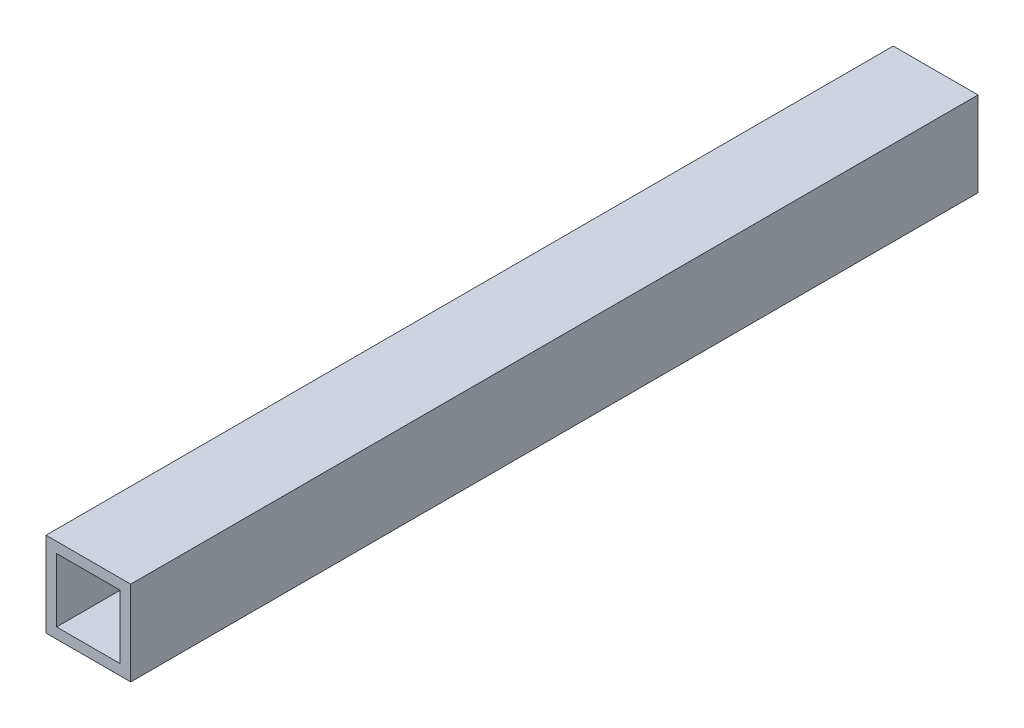
ISO-10303-21;
HEADER;
FILE_DESCRIPTION(('STEP AP214'),'2;1');
FILE_NAME('part.step','',(''),(''),'','','');
FILE_SCHEMA(('AUTOMOTIVE_DESIGN { 1 0 10303 214 1 1 1 1 }'));
ENDSEC;
DATA;
#1=APPLICATION_CONTEXT('core data for automotive mechanical design processes');
#2=APPLICATION_PROTOCOL_DEFINITION('international standard','automotive_design',2000,#1);
#3=PRODUCT_CONTEXT('',#1,'mechanical');
#4=PRODUCT('Part','Part','',(#3));
#5=PRODUCT_RELATED_PRODUCT_CATEGORY('part','',(#4));
#6=PRODUCT_DEFINITION_FORMATION('','',#4);
#7=PRODUCT_DEFINITION_CONTEXT('part definition',#1,'design');
#8=PRODUCT_DEFINITION('design','',#6,#7);
#9=PRODUCT_DEFINITION_SHAPE('','',#8);
#10=(LENGTH_UNIT() NAMED_UNIT(*) SI_UNIT(.MILLI.,.METRE.));
#11=(NAMED_UNIT(*) PLANE_ANGLE_UNIT() SI_UNIT($,.RADIAN.));
#12=(NAMED_UNIT(*) SI_UNIT($,.STERADIAN.) SOLID_ANGLE_UNIT());
#13=UNCERTAINTY_MEASURE_WITH_UNIT(LENGTH_MEASURE(1.E-05),#10,'distance_accuracy_value','');
#14=(GEOMETRIC_REPRESENTATION_CONTEXT(3) GLOBAL_UNCERTAINTY_ASSIGNED_CONTEXT((#13)) GLOBAL_UNIT_ASSIGNED_CONTEXT((#10,
#11,#12)) REPRESENTATION_CONTEXT('',''));
#15=CARTESIAN_POINT('',(0.,0.,0.));
#16=DIRECTION('',(0.,0.,1.));
#17=DIRECTION('',(1.,0.,0.));
#18=AXIS2_PLACEMENT_3D('',#15,#16,#17);
#19=CARTESIAN_POINT('',(0.,0.,400.));
#20=DIRECTION('',(0.,0.,1.));
#21=DIRECTION('',(1.,0.,0.));
#22=AXIS2_PLACEMENT_3D('',#19,#20,#21);
#23=PLANE('',#22);
#24=DIRECTION('',(0.,-1.,0.));
#25=VECTOR('',#24,1.);
#26=CARTESIAN_POINT('',(0.,0.,400.));
#27=LINE('',#26,#25);
#28=CARTESIAN_POINT('',(0.,40.,400.));
#29=VERTEX_POINT('',#28);
#30=CARTESIAN_POINT('',(0.,0.,400.));
#31=VERTEX_POINT('',#30);
#32=EDGE_CURVE('E159',#29,#31,#27,.T.);
#33=ORIENTED_EDGE('',*,*,#32,.T.);
#34=DIRECTION('',(1.,0.,0.));
#35=VECTOR('',#34,1.);
#36=CARTESIAN_POINT('',(0.,0.,400.));
#37=LINE('',#36,#35);
#38=CARTESIAN_POINT('',(40.,0.,400.));
#39=VERTEX_POINT('',#38);
#40=EDGE_CURVE('E162',#31,#39,#37,.T.);
#41=ORIENTED_EDGE('',*,*,#40,.T.);
#42=DIRECTION('',(0.,1.,0.));
#43=VECTOR('',#42,1.);
#44=CARTESIAN_POINT('',(40.,0.,400.));
#45=LINE('',#44,#43);
#46=CARTESIAN_POINT('',(40.,40.,400.));
#47=VERTEX_POINT('',#46);
#48=EDGE_CURVE('E165',#39,#47,#45,.T.);
#49=ORIENTED_EDGE('',*,*,#48,.T.);
#50=DIRECTION('',(-1.,0.,0.));
#51=VECTOR('',#50,1.);
#52=CARTESIAN_POINT('',(0.,40.,400.));
#53=LINE('',#52,#51);
#54=EDGE_CURVE('E167',#47,#29,#53,.T.);
#55=ORIENTED_EDGE('',*,*,#54,.T.);
#56=EDGE_LOOP('',(#33,#41,#49,#55));
#57=FACE_BOUND('',#56,.T.);
#58=DIRECTION('',(1.,0.,0.));
#59=VECTOR('',#58,1.);
#60=CARTESIAN_POINT('',(0.,5.,400.));
#61=LINE('',#60,#59);
#62=CARTESIAN_POINT('',(5.,5.,400.));
#63=VERTEX_POINT('',#62);
#64=CARTESIAN_POINT('',(35.,5.,400.));
#65=VERTEX_POINT('',#64);
#66=EDGE_CURVE('E131',#63,#65,#61,.T.);
#67=ORIENTED_EDGE('',*,*,#66,.F.);
#68=DIRECTION('',(0.,-1.,0.));
#69=VECTOR('',#68,1.);
#70=CARTESIAN_POINT('',(5.,40.,400.));
#71=LINE('',#70,#69);
#72=CARTESIAN_POINT('',(5.,35.,400.));
#73=VERTEX_POINT('',#72);
#74=EDGE_CURVE('E123',#73,#63,#71,.T.);
#75=ORIENTED_EDGE('',*,*,#74,.F.);
#76=DIRECTION('',(-1.,0.,0.));
#77=VECTOR('',#76,1.);
#78=CARTESIAN_POINT('',(0.,35.,400.));
#79=LINE('',#78,#77);
#80=CARTESIAN_POINT('',(35.,35.,400.));
#81=VERTEX_POINT('',#80);
#82=EDGE_CURVE('E145',#81,#73,#79,.T.);
#83=ORIENTED_EDGE('',*,*,#82,.F.);
#84=DIRECTION('',(0.,1.,0.));
#85=VECTOR('',#84,1.);
#86=CARTESIAN_POINT('',(35.,40.,400.));
#87=LINE('',#86,#85);
#88=EDGE_CURVE('E143',#65,#81,#87,.T.);
#89=ORIENTED_EDGE('',*,*,#88,.F.);
#90=EDGE_LOOP('',(#67,#75,#83,#89));
#91=FACE_BOUND('',#90,.T.);
#92=ADVANCED_FACE('F58',(#57,#91),#23,.T.);
#93=CARTESIAN_POINT('',(0.,0.,0.));
#94=DIRECTION('',(0.,0.,1.));
#95=DIRECTION('',(1.,0.,0.));
#96=AXIS2_PLACEMENT_3D('',#93,#94,#95);
#97=PLANE('',#96);
#98=DIRECTION('',(0.,-1.,0.));
#99=VECTOR('',#98,1.);
#100=CARTESIAN_POINT('',(0.,0.,0.));
#101=LINE('',#100,#99);
#102=CARTESIAN_POINT('',(0.,40.,0.));
#103=VERTEX_POINT('',#102);
#104=CARTESIAN_POINT('',(0.,0.,0.));
#105=VERTEX_POINT('',#104);
#106=EDGE_CURVE('E139',#103,#105,#101,.T.);
#107=ORIENTED_EDGE('',*,*,#106,.F.);
#108=DIRECTION('',(-1.,0.,0.));
#109=VECTOR('',#108,1.);
#110=CARTESIAN_POINT('',(0.,40.,0.));
#111=LINE('',#110,#109);
#112=CARTESIAN_POINT('',(40.,40.,0.));
#113=VERTEX_POINT('',#112);
#114=EDGE_CURVE('E163',#113,#103,#111,.T.);
#115=ORIENTED_EDGE('',*,*,#114,.F.);
#116=DIRECTION('',(0.,1.,0.));
#117=VECTOR('',#116,1.);
#118=CARTESIAN_POINT('',(40.,0.,0.));
#119=LINE('',#118,#117);
#120=CARTESIAN_POINT('',(40.,0.,0.));
#121=VERTEX_POINT('',#120);
#122=EDGE_CURVE('E174',#121,#113,#119,.T.);
#123=ORIENTED_EDGE('',*,*,#122,.F.);
#124=DIRECTION('',(1.,0.,0.));
#125=VECTOR('',#124,1.);
#126=CARTESIAN_POINT('',(0.,0.,0.));
#127=LINE('',#126,#125);
#128=EDGE_CURVE('E172',#105,#121,#127,.T.);
#129=ORIENTED_EDGE('',*,*,#128,.F.);
#130=EDGE_LOOP('',(#107,#115,#123,#129));
#131=FACE_BOUND('',#130,.T.);
#132=DIRECTION('',(0.,-1.,0.));
#133=VECTOR('',#132,1.);
#134=CARTESIAN_POINT('',(5.,40.,0.));
#135=LINE('',#134,#133);
#136=CARTESIAN_POINT('',(5.,35.,0.));
#137=VERTEX_POINT('',#136);
#138=CARTESIAN_POINT('',(5.,5.,0.));
#139=VERTEX_POINT('',#138);
#140=EDGE_CURVE('E81',#137,#139,#135,.T.);
#141=ORIENTED_EDGE('',*,*,#140,.T.);
#142=DIRECTION('',(1.,0.,0.));
#143=VECTOR('',#142,1.);
#144=CARTESIAN_POINT('',(0.,5.,0.));
#145=LINE('',#144,#143);
#146=CARTESIAN_POINT('',(35.,5.,0.));
#147=VERTEX_POINT('',#146);
#148=EDGE_CURVE('E138',#139,#147,#145,.T.);
#149=ORIENTED_EDGE('',*,*,#148,.T.);
#150=DIRECTION('',(0.,1.,0.));
#151=VECTOR('',#150,1.);
#152=CARTESIAN_POINT('',(35.,40.,0.));
#153=LINE('',#152,#151);
#154=CARTESIAN_POINT('',(35.,35.,0.));
#155=VERTEX_POINT('',#154);
#156=EDGE_CURVE('E151',#147,#155,#153,.T.);
#157=ORIENTED_EDGE('',*,*,#156,.T.);
#158=DIRECTION('',(-1.,0.,0.));
#159=VECTOR('',#158,1.);
#160=CARTESIAN_POINT('',(0.,35.,0.));
#161=LINE('',#160,#159);
#162=EDGE_CURVE('E132',#155,#137,#161,.T.);
#163=ORIENTED_EDGE('',*,*,#162,.T.);
#164=EDGE_LOOP('',(#141,#149,#157,#163));
#165=FACE_BOUND('',#164,.T.);
#166=ADVANCED_FACE('F192',(#131,#165),#97,.F.);
#167=CARTESIAN_POINT('',(0.,0.,400.));
#168=DIRECTION('',(1.,0.,0.));
#169=DIRECTION('',(0.,0.,-1.));
#170=AXIS2_PLACEMENT_3D('',#167,#168,#169);
#171=PLANE('',#170);
#172=ORIENTED_EDGE('',*,*,#106,.T.);
#173=DIRECTION('',(0.,0.,-1.));
#174=VECTOR('',#173,1.);
#175=CARTESIAN_POINT('',(0.,0.,400.));
#176=LINE('',#175,#174);
#177=EDGE_CURVE('E12',#31,#105,#176,.T.);
#178=ORIENTED_EDGE('',*,*,#177,.F.);
#179=ORIENTED_EDGE('',*,*,#32,.F.);
#180=DIRECTION('',(0.,0.,-1.));
#181=VECTOR('',#180,1.);
#182=CARTESIAN_POINT('',(0.,40.,400.));
#183=LINE('',#182,#181);
#184=EDGE_CURVE('E169',#29,#103,#183,.T.);
#185=ORIENTED_EDGE('',*,*,#184,.T.);
#186=EDGE_LOOP('',(#172,#178,#179,#185));
#187=FACE_BOUND('',#186,.T.);
#188=ADVANCED_FACE('F60',(#187),#171,.F.);
#189=CARTESIAN_POINT('',(0.,0.,400.));
#190=DIRECTION('',(0.,1.,0.));
#191=DIRECTION('',(0.,0.,1.));
#192=AXIS2_PLACEMENT_3D('',#189,#190,#191);
#193=PLANE('',#192);
#194=ORIENTED_EDGE('',*,*,#128,.T.);
#195=DIRECTION('',(0.,0.,-1.));
#196=VECTOR('',#195,1.);
#197=CARTESIAN_POINT('',(40.,0.,400.));
#198=LINE('',#197,#196);
#199=EDGE_CURVE('E66',#39,#121,#198,.T.);
#200=ORIENTED_EDGE('',*,*,#199,.F.);
#201=ORIENTED_EDGE('',*,*,#40,.F.);
#202=ORIENTED_EDGE('',*,*,#177,.T.);
#203=EDGE_LOOP('',(#194,#200,#201,#202));
#204=FACE_BOUND('',#203,.T.);
#205=ADVANCED_FACE('F202',(#204),#193,.F.);
#206=CARTESIAN_POINT('',(40.,0.,400.));
#207=DIRECTION('',(-1.,0.,0.));
#208=DIRECTION('',(0.,0.,1.));
#209=AXIS2_PLACEMENT_3D('',#206,#207,#208);
#210=PLANE('',#209);
#211=ORIENTED_EDGE('',*,*,#122,.T.);
#212=DIRECTION('',(0.,0.,-1.));
#213=VECTOR('',#212,1.);
#214=CARTESIAN_POINT('',(40.,40.,400.));
#215=LINE('',#214,#213);
#216=EDGE_CURVE('E179',#47,#113,#215,.T.);
#217=ORIENTED_EDGE('',*,*,#216,.F.);
#218=ORIENTED_EDGE('',*,*,#48,.F.);
#219=ORIENTED_EDGE('',*,*,#199,.T.);
#220=EDGE_LOOP('',(#211,#217,#218,#219));
#221=FACE_BOUND('',#220,.T.);
#222=ADVANCED_FACE('F186',(#221),#210,.F.);
#223=CARTESIAN_POINT('',(0.,40.,400.));
#224=DIRECTION('',(0.,-1.,0.));
#225=DIRECTION('',(0.,0.,-1.));
#226=AXIS2_PLACEMENT_3D('',#223,#224,#225);
#227=PLANE('',#226);
#228=ORIENTED_EDGE('',*,*,#114,.T.);
#229=ORIENTED_EDGE('',*,*,#184,.F.);
#230=ORIENTED_EDGE('',*,*,#54,.F.);
#231=ORIENTED_EDGE('',*,*,#216,.T.);
#232=EDGE_LOOP('',(#228,#229,#230,#231));
#233=FACE_BOUND('',#232,.T.);
#234=ADVANCED_FACE('F196',(#233),#227,.F.);
#235=CARTESIAN_POINT('',(5.,40.,400.));
#236=DIRECTION('',(1.,0.,0.));
#237=DIRECTION('',(0.,0.,-1.));
#238=AXIS2_PLACEMENT_3D('',#235,#236,#237);
#239=PLANE('',#238);
#240=ORIENTED_EDGE('',*,*,#140,.F.);
#241=DIRECTION('',(0.,0.,-1.));
#242=VECTOR('',#241,1.);
#243=CARTESIAN_POINT('',(5.,35.,400.));
#244=LINE('',#243,#242);
#245=EDGE_CURVE('E127',#73,#137,#244,.T.);
#246=ORIENTED_EDGE('',*,*,#245,.F.);
#247=ORIENTED_EDGE('',*,*,#74,.T.);
#248=DIRECTION('',(0.,0.,-1.));
#249=VECTOR('',#248,1.);
#250=CARTESIAN_POINT('',(5.,5.,400.));
#251=LINE('',#250,#249);
#252=EDGE_CURVE('E126',#63,#139,#251,.T.);
#253=ORIENTED_EDGE('',*,*,#252,.T.);
#254=EDGE_LOOP('',(#240,#246,#247,#253));
#255=FACE_BOUND('',#254,.T.);
#256=ADVANCED_FACE('F125',(#255),#239,.T.);
#257=CARTESIAN_POINT('',(0.,5.,400.));
#258=DIRECTION('',(0.,1.,0.));
#259=DIRECTION('',(0.,0.,1.));
#260=AXIS2_PLACEMENT_3D('',#257,#258,#259);
#261=PLANE('',#260);
#262=ORIENTED_EDGE('',*,*,#148,.F.);
#263=ORIENTED_EDGE('',*,*,#252,.F.);
#264=ORIENTED_EDGE('',*,*,#66,.T.);
#265=DIRECTION('',(0.,0.,-1.));
#266=VECTOR('',#265,1.);
#267=CARTESIAN_POINT('',(35.,5.,400.));
#268=LINE('',#267,#266);
#269=EDGE_CURVE('E140',#65,#147,#268,.T.);
#270=ORIENTED_EDGE('',*,*,#269,.T.);
#271=EDGE_LOOP('',(#262,#263,#264,#270));
#272=FACE_BOUND('',#271,.T.);
#273=ADVANCED_FACE('F135',(#272),#261,.T.);
#274=CARTESIAN_POINT('',(35.,40.,400.));
#275=DIRECTION('',(-1.,0.,0.));
#276=DIRECTION('',(0.,0.,1.));
#277=AXIS2_PLACEMENT_3D('',#274,#275,#276);
#278=PLANE('',#277);
#279=ORIENTED_EDGE('',*,*,#156,.F.);
#280=ORIENTED_EDGE('',*,*,#269,.F.);
#281=ORIENTED_EDGE('',*,*,#88,.T.);
#282=DIRECTION('',(0.,0.,-1.));
#283=VECTOR('',#282,1.);
#284=CARTESIAN_POINT('',(35.,35.,400.));
#285=LINE('',#284,#283);
#286=EDGE_CURVE('E73',#81,#155,#285,.T.);
#287=ORIENTED_EDGE('',*,*,#286,.T.);
#288=EDGE_LOOP('',(#279,#280,#281,#287));
#289=FACE_BOUND('',#288,.T.);
#290=ADVANCED_FACE('F225',(#289),#278,.T.);
#291=CARTESIAN_POINT('',(0.,35.,400.));
#292=DIRECTION('',(0.,-1.,0.));
#293=DIRECTION('',(0.,0.,-1.));
#294=AXIS2_PLACEMENT_3D('',#291,#292,#293);
#295=PLANE('',#294);
#296=ORIENTED_EDGE('',*,*,#162,.F.);
#297=ORIENTED_EDGE('',*,*,#286,.F.);
#298=ORIENTED_EDGE('',*,*,#82,.T.);
#299=ORIENTED_EDGE('',*,*,#245,.T.);
#300=EDGE_LOOP('',(#296,#297,#298,#299));
#301=FACE_BOUND('',#300,.T.);
#302=ADVANCED_FACE('F229',(#301),#295,.T.);
#303=CLOSED_SHELL('',(#92,#166,#188,#205,#222,#234,#256,#273,#290,#302));
#304=MANIFOLD_SOLID_BREP('B2',#303);
#305=ADVANCED_BREP_SHAPE_REPRESENTATION('',(#18,#304),#14);
#306=SHAPE_DEFINITION_REPRESENTATION(#9,#305);
ENDSEC;
END-ISO-10303-21;
